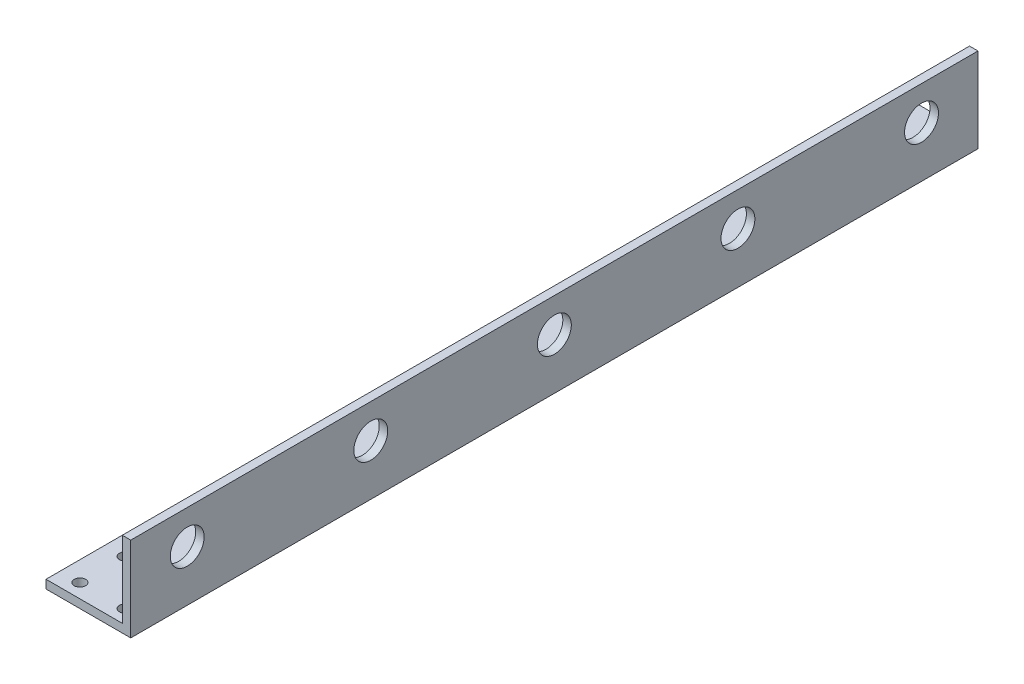
ISO-10303-21;
HEADER;
FILE_DESCRIPTION(('STEP AP214'),'2;1');
FILE_NAME('part.step','',(''),(''),'','','');
FILE_SCHEMA(('AUTOMOTIVE_DESIGN { 1 0 10303 214 1 1 1 1 }'));
ENDSEC;
DATA;
#1=APPLICATION_CONTEXT('core data for automotive mechanical design processes');
#2=APPLICATION_PROTOCOL_DEFINITION('international standard','automotive_design',2000,#1);
#3=PRODUCT_CONTEXT('',#1,'mechanical');
#4=PRODUCT('Part','Part','',(#3));
#5=PRODUCT_RELATED_PRODUCT_CATEGORY('part','',(#4));
#6=PRODUCT_DEFINITION_FORMATION('','',#4);
#7=PRODUCT_DEFINITION_CONTEXT('part definition',#1,'design');
#8=PRODUCT_DEFINITION('design','',#6,#7);
#9=PRODUCT_DEFINITION_SHAPE('','',#8);
#10=(LENGTH_UNIT() NAMED_UNIT(*) SI_UNIT(.MILLI.,.METRE.));
#11=(NAMED_UNIT(*) PLANE_ANGLE_UNIT() SI_UNIT($,.RADIAN.));
#12=(NAMED_UNIT(*) SI_UNIT($,.STERADIAN.) SOLID_ANGLE_UNIT());
#13=UNCERTAINTY_MEASURE_WITH_UNIT(LENGTH_MEASURE(1.E-05),#10,'distance_accuracy_value','');
#14=(GEOMETRIC_REPRESENTATION_CONTEXT(3) GLOBAL_UNCERTAINTY_ASSIGNED_CONTEXT((#13)) GLOBAL_UNIT_ASSIGNED_CONTEXT((#10,
#11,#12)) REPRESENTATION_CONTEXT('',''));
#15=CARTESIAN_POINT('',(0.,0.,0.));
#16=DIRECTION('',(0.,0.,1.));
#17=DIRECTION('',(1.,0.,0.));
#18=AXIS2_PLACEMENT_3D('',#15,#16,#17);
#19=CARTESIAN_POINT('',(15.,-15.,300.));
#20=DIRECTION('',(-1.,0.,0.));
#21=DIRECTION('',(0.,0.,1.));
#22=AXIS2_PLACEMENT_3D('',#19,#20,#21);
#23=PLANE('',#22);
#24=CARTESIAN_POINT('',(15.,2.99999999999999,20.));
#25=DIRECTION('',(-1.,0.,0.));
#26=DIRECTION('',(0.,0.,1.));
#27=AXIS2_PLACEMENT_3D('',#24,#25,#26);
#28=CIRCLE('',#27,6.);
#29=CARTESIAN_POINT('',(15.,2.99999999999999,26.));
#30=VERTEX_POINT('',#29);
#31=EDGE_CURVE('E133',#30,#30,#28,.T.);
#32=ORIENTED_EDGE('',*,*,#31,.T.);
#33=EDGE_LOOP('',(#32));
#34=FACE_BOUND('',#33,.T.);
#35=CARTESIAN_POINT('',(15.,2.99999999999999,85.));
#36=DIRECTION('',(-1.,0.,0.));
#37=DIRECTION('',(0.,0.,1.));
#38=AXIS2_PLACEMENT_3D('',#35,#36,#37);
#39=CIRCLE('',#38,6.);
#40=CARTESIAN_POINT('',(15.,2.99999999999999,91.));
#41=VERTEX_POINT('',#40);
#42=EDGE_CURVE('E187',#41,#41,#39,.T.);
#43=ORIENTED_EDGE('',*,*,#42,.T.);
#44=EDGE_LOOP('',(#43));
#45=FACE_BOUND('',#44,.T.);
#46=CARTESIAN_POINT('',(15.,2.99999999999999,150.));
#47=DIRECTION('',(-1.,0.,0.));
#48=DIRECTION('',(0.,0.,1.));
#49=AXIS2_PLACEMENT_3D('',#46,#47,#48);
#50=CIRCLE('',#49,5.99999999999999);
#51=CARTESIAN_POINT('',(15.,2.99999999999999,156.));
#52=VERTEX_POINT('',#51);
#53=EDGE_CURVE('E191',#52,#52,#50,.T.);
#54=ORIENTED_EDGE('',*,*,#53,.T.);
#55=EDGE_LOOP('',(#54));
#56=FACE_BOUND('',#55,.T.);
#57=CARTESIAN_POINT('',(15.,2.99999999999999,215.));
#58=DIRECTION('',(-1.,0.,0.));
#59=DIRECTION('',(0.,0.,1.));
#60=AXIS2_PLACEMENT_3D('',#57,#58,#59);
#61=CIRCLE('',#60,5.99999999999999);
#62=CARTESIAN_POINT('',(15.,2.99999999999999,221.));
#63=VERTEX_POINT('',#62);
#64=EDGE_CURVE('E195',#63,#63,#61,.T.);
#65=ORIENTED_EDGE('',*,*,#64,.T.);
#66=EDGE_LOOP('',(#65));
#67=FACE_BOUND('',#66,.T.);
#68=CARTESIAN_POINT('',(15.,2.99999999999999,280.));
#69=DIRECTION('',(-1.,0.,0.));
#70=DIRECTION('',(0.,0.,1.));
#71=AXIS2_PLACEMENT_3D('',#68,#69,#70);
#72=CIRCLE('',#71,5.99999999999999);
#73=CARTESIAN_POINT('',(15.,2.99999999999999,286.));
#74=VERTEX_POINT('',#73);
#75=EDGE_CURVE('E198',#74,#74,#72,.T.);
#76=ORIENTED_EDGE('',*,*,#75,.T.);
#77=EDGE_LOOP('',(#76));
#78=FACE_BOUND('',#77,.T.);
#79=DIRECTION('',(0.,1.,0.));
#80=VECTOR('',#79,1.);
#81=CARTESIAN_POINT('',(15.,-15.,0.));
#82=LINE('',#81,#80);
#83=CARTESIAN_POINT('',(15.,-15.,0.));
#84=VERTEX_POINT('',#83);
#85=CARTESIAN_POINT('',(15.,15.,0.));
#86=VERTEX_POINT('',#85);
#87=EDGE_CURVE('E128',#84,#86,#82,.T.);
#88=ORIENTED_EDGE('',*,*,#87,.T.);
#89=DIRECTION('',(0.,0.,-1.));
#90=VECTOR('',#89,1.);
#91=CARTESIAN_POINT('',(15.,15.,300.));
#92=LINE('',#91,#90);
#93=CARTESIAN_POINT('',(15.,15.,300.));
#94=VERTEX_POINT('',#93);
#95=EDGE_CURVE('E11',#94,#86,#92,.T.);
#96=ORIENTED_EDGE('',*,*,#95,.F.);
#97=DIRECTION('',(0.,1.,0.));
#98=VECTOR('',#97,1.);
#99=CARTESIAN_POINT('',(15.,-15.,300.));
#100=LINE('',#99,#98);
#101=CARTESIAN_POINT('',(15.,-15.,300.));
#102=VERTEX_POINT('',#101);
#103=EDGE_CURVE('E145',#102,#94,#100,.T.);
#104=ORIENTED_EDGE('',*,*,#103,.F.);
#105=DIRECTION('',(0.,0.,-1.));
#106=VECTOR('',#105,1.);
#107=CARTESIAN_POINT('',(15.,-15.,300.));
#108=LINE('',#107,#106);
#109=EDGE_CURVE('E124',#102,#84,#108,.T.);
#110=ORIENTED_EDGE('',*,*,#109,.T.);
#111=EDGE_LOOP('',(#88,#96,#104,#110));
#112=FACE_BOUND('',#111,.T.);
#113=ADVANCED_FACE('F39',(#34,#45,#56,#67,#78,#112),#23,.F.);
#114=CARTESIAN_POINT('',(12.,15.,300.));
#115=DIRECTION('',(0.,-1.,0.));
#116=DIRECTION('',(0.,0.,-1.));
#117=AXIS2_PLACEMENT_3D('',#114,#115,#116);
#118=PLANE('',#117);
#119=DIRECTION('',(-1.,0.,0.));
#120=VECTOR('',#119,1.);
#121=CARTESIAN_POINT('',(12.,15.,0.));
#122=LINE('',#121,#120);
#123=CARTESIAN_POINT('',(12.,15.,0.));
#124=VERTEX_POINT('',#123);
#125=EDGE_CURVE('E132',#86,#124,#122,.T.);
#126=ORIENTED_EDGE('',*,*,#125,.T.);
#127=DIRECTION('',(0.,0.,-1.));
#128=VECTOR('',#127,1.);
#129=CARTESIAN_POINT('',(12.,15.,300.));
#130=LINE('',#129,#128);
#131=CARTESIAN_POINT('',(12.,15.,300.));
#132=VERTEX_POINT('',#131);
#133=EDGE_CURVE('E48',#132,#124,#130,.T.);
#134=ORIENTED_EDGE('',*,*,#133,.F.);
#135=DIRECTION('',(-1.,0.,0.));
#136=VECTOR('',#135,1.);
#137=CARTESIAN_POINT('',(12.,15.,300.));
#138=LINE('',#137,#136);
#139=EDGE_CURVE('E93',#94,#132,#138,.T.);
#140=ORIENTED_EDGE('',*,*,#139,.F.);
#141=ORIENTED_EDGE('',*,*,#95,.T.);
#142=EDGE_LOOP('',(#126,#134,#140,#141));
#143=FACE_BOUND('',#142,.T.);
#144=ADVANCED_FACE('F176',(#143),#118,.F.);
#145=CARTESIAN_POINT('',(12.,15.,300.));
#146=DIRECTION('',(1.,0.,0.));
#147=DIRECTION('',(0.,0.,-1.));
#148=AXIS2_PLACEMENT_3D('',#145,#146,#147);
#149=PLANE('',#148);
#150=CARTESIAN_POINT('',(12.,2.99999999999999,20.));
#151=DIRECTION('',(-1.,0.,0.));
#152=DIRECTION('',(0.,0.,1.));
#153=AXIS2_PLACEMENT_3D('',#150,#151,#152);
#154=CIRCLE('',#153,6.);
#155=CARTESIAN_POINT('',(12.,2.99999999999999,26.));
#156=VERTEX_POINT('',#155);
#157=EDGE_CURVE('E201',#156,#156,#154,.T.);
#158=ORIENTED_EDGE('',*,*,#157,.F.);
#159=EDGE_LOOP('',(#158));
#160=FACE_BOUND('',#159,.T.);
#161=CARTESIAN_POINT('',(12.,2.99999999999999,85.));
#162=DIRECTION('',(-1.,0.,0.));
#163=DIRECTION('',(0.,0.,1.));
#164=AXIS2_PLACEMENT_3D('',#161,#162,#163);
#165=CIRCLE('',#164,6.);
#166=CARTESIAN_POINT('',(12.,2.99999999999999,91.));
#167=VERTEX_POINT('',#166);
#168=EDGE_CURVE('E207',#167,#167,#165,.T.);
#169=ORIENTED_EDGE('',*,*,#168,.F.);
#170=EDGE_LOOP('',(#169));
#171=FACE_BOUND('',#170,.T.);
#172=CARTESIAN_POINT('',(12.,2.99999999999999,150.));
#173=DIRECTION('',(-1.,0.,0.));
#174=DIRECTION('',(0.,0.,1.));
#175=AXIS2_PLACEMENT_3D('',#172,#173,#174);
#176=CIRCLE('',#175,5.99999999999999);
#177=CARTESIAN_POINT('',(12.,2.99999999999999,156.));
#178=VERTEX_POINT('',#177);
#179=EDGE_CURVE('E230',#178,#178,#176,.T.);
#180=ORIENTED_EDGE('',*,*,#179,.F.);
#181=EDGE_LOOP('',(#180));
#182=FACE_BOUND('',#181,.T.);
#183=CARTESIAN_POINT('',(12.,2.99999999999999,215.));
#184=DIRECTION('',(-1.,0.,0.));
#185=DIRECTION('',(0.,0.,1.));
#186=AXIS2_PLACEMENT_3D('',#183,#184,#185);
#187=CIRCLE('',#186,5.99999999999999);
#188=CARTESIAN_POINT('',(12.,2.99999999999999,221.));
#189=VERTEX_POINT('',#188);
#190=EDGE_CURVE('E225',#189,#189,#187,.T.);
#191=ORIENTED_EDGE('',*,*,#190,.F.);
#192=EDGE_LOOP('',(#191));
#193=FACE_BOUND('',#192,.T.);
#194=CARTESIAN_POINT('',(12.,2.99999999999999,280.));
#195=DIRECTION('',(-1.,0.,0.));
#196=DIRECTION('',(0.,0.,1.));
#197=AXIS2_PLACEMENT_3D('',#194,#195,#196);
#198=CIRCLE('',#197,5.99999999999999);
#199=CARTESIAN_POINT('',(12.,2.99999999999999,286.));
#200=VERTEX_POINT('',#199);
#201=EDGE_CURVE('E210',#200,#200,#198,.T.);
#202=ORIENTED_EDGE('',*,*,#201,.F.);
#203=EDGE_LOOP('',(#202));
#204=FACE_BOUND('',#203,.T.);
#205=DIRECTION('',(0.,-1.,0.));
#206=VECTOR('',#205,1.);
#207=CARTESIAN_POINT('',(12.,15.,0.));
#208=LINE('',#207,#206);
#209=CARTESIAN_POINT('',(12.,-12.,0.));
#210=VERTEX_POINT('',#209);
#211=EDGE_CURVE('E136',#124,#210,#208,.T.);
#212=ORIENTED_EDGE('',*,*,#211,.T.);
#213=DIRECTION('',(0.,0.,-1.));
#214=VECTOR('',#213,1.);
#215=CARTESIAN_POINT('',(12.,-12.,300.));
#216=LINE('',#215,#214);
#217=CARTESIAN_POINT('',(12.,-12.,300.));
#218=VERTEX_POINT('',#217);
#219=EDGE_CURVE('E117',#218,#210,#216,.T.);
#220=ORIENTED_EDGE('',*,*,#219,.F.);
#221=DIRECTION('',(0.,-1.,0.));
#222=VECTOR('',#221,1.);
#223=CARTESIAN_POINT('',(12.,15.,300.));
#224=LINE('',#223,#222);
#225=EDGE_CURVE('E106',#132,#218,#224,.T.);
#226=ORIENTED_EDGE('',*,*,#225,.F.);
#227=ORIENTED_EDGE('',*,*,#133,.T.);
#228=EDGE_LOOP('',(#212,#220,#226,#227));
#229=FACE_BOUND('',#228,.T.);
#230=ADVANCED_FACE('F155',(#160,#171,#182,#193,#204,#229),#149,.F.);
#231=CARTESIAN_POINT('',(-15.,-12.,300.));
#232=DIRECTION('',(0.,-1.,0.));
#233=DIRECTION('',(0.,0.,-1.));
#234=AXIS2_PLACEMENT_3D('',#231,#232,#233);
#235=PLANE('',#234);
#236=CARTESIAN_POINT('',(-7.99999999999994,-12.,21.0000000000001));
#237=DIRECTION('',(0.,-1.,0.));
#238=DIRECTION('',(0.,0.,-1.));
#239=AXIS2_PLACEMENT_3D('',#236,#237,#238);
#240=CIRCLE('',#239,2.);
#241=CARTESIAN_POINT('',(-7.99999999999994,-12.,19.0000000000001));
#242=VERTEX_POINT('',#241);
#243=EDGE_CURVE('E226',#242,#242,#240,.T.);
#244=ORIENTED_EDGE('',*,*,#243,.T.);
#245=EDGE_LOOP('',(#244));
#246=FACE_BOUND('',#245,.T.);
#247=CARTESIAN_POINT('',(8.,-12.,295.));
#248=DIRECTION('',(0.,-1.,0.));
#249=DIRECTION('',(0.,0.,-1.));
#250=AXIS2_PLACEMENT_3D('',#247,#248,#249);
#251=CIRCLE('',#250,2.);
#252=CARTESIAN_POINT('',(8.,-12.,293.));
#253=VERTEX_POINT('',#252);
#254=EDGE_CURVE('E240',#253,#253,#251,.T.);
#255=ORIENTED_EDGE('',*,*,#254,.T.);
#256=EDGE_LOOP('',(#255));
#257=FACE_BOUND('',#256,.T.);
#258=CARTESIAN_POINT('',(8.00000000000017,-12.,279.));
#259=DIRECTION('',(0.,-1.,0.));
#260=DIRECTION('',(0.,0.,-1.));
#261=AXIS2_PLACEMENT_3D('',#258,#259,#260);
#262=CIRCLE('',#261,2.);
#263=CARTESIAN_POINT('',(8.00000000000017,-12.,277.));
#264=VERTEX_POINT('',#263);
#265=EDGE_CURVE('E244',#264,#264,#262,.T.);
#266=ORIENTED_EDGE('',*,*,#265,.T.);
#267=EDGE_LOOP('',(#266));
#268=FACE_BOUND('',#267,.T.);
#269=CARTESIAN_POINT('',(-7.99999999999983,-12.,279.));
#270=DIRECTION('',(0.,-1.,0.));
#271=DIRECTION('',(0.,0.,-1.));
#272=AXIS2_PLACEMENT_3D('',#269,#270,#271);
#273=CIRCLE('',#272,2.00000000000001);
#274=CARTESIAN_POINT('',(-7.99999999999983,-12.,277.));
#275=VERTEX_POINT('',#274);
#276=EDGE_CURVE('E248',#275,#275,#273,.T.);
#277=ORIENTED_EDGE('',*,*,#276,.T.);
#278=EDGE_LOOP('',(#277));
#279=FACE_BOUND('',#278,.T.);
#280=CARTESIAN_POINT('',(-8.00000000000003,-12.,5.00000000000003));
#281=DIRECTION('',(0.,-1.,0.));
#282=DIRECTION('',(0.,0.,-1.));
#283=AXIS2_PLACEMENT_3D('',#280,#281,#282);
#284=CIRCLE('',#283,2.);
#285=CARTESIAN_POINT('',(-8.00000000000003,-12.,3.00000000000003));
#286=VERTEX_POINT('',#285);
#287=EDGE_CURVE('E252',#286,#286,#284,.T.);
#288=ORIENTED_EDGE('',*,*,#287,.T.);
#289=EDGE_LOOP('',(#288));
#290=FACE_BOUND('',#289,.T.);
#291=CARTESIAN_POINT('',(8.,-12.,5.));
#292=DIRECTION('',(0.,-1.,0.));
#293=DIRECTION('',(0.,0.,-1.));
#294=AXIS2_PLACEMENT_3D('',#291,#292,#293);
#295=CIRCLE('',#294,2.);
#296=CARTESIAN_POINT('',(8.,-12.,3.));
#297=VERTEX_POINT('',#296);
#298=EDGE_CURVE('E256',#297,#297,#295,.T.);
#299=ORIENTED_EDGE('',*,*,#298,.T.);
#300=EDGE_LOOP('',(#299));
#301=FACE_BOUND('',#300,.T.);
#302=CARTESIAN_POINT('',(8.00000000000009,-12.,20.9999999999999));
#303=DIRECTION('',(0.,-1.,0.));
#304=DIRECTION('',(0.,0.,-1.));
#305=AXIS2_PLACEMENT_3D('',#302,#303,#304);
#306=CIRCLE('',#305,2.);
#307=CARTESIAN_POINT('',(8.00000000000009,-12.,18.9999999999999));
#308=VERTEX_POINT('',#307);
#309=EDGE_CURVE('E260',#308,#308,#306,.T.);
#310=ORIENTED_EDGE('',*,*,#309,.T.);
#311=EDGE_LOOP('',(#310));
#312=FACE_BOUND('',#311,.T.);
#313=CARTESIAN_POINT('',(-7.99999999999984,-12.,295.));
#314=DIRECTION('',(0.,-1.,0.));
#315=DIRECTION('',(0.,0.,-1.));
#316=AXIS2_PLACEMENT_3D('',#313,#314,#315);
#317=CIRCLE('',#316,2.00000000000005);
#318=CARTESIAN_POINT('',(-7.99999999999984,-12.,293.));
#319=VERTEX_POINT('',#318);
#320=EDGE_CURVE('E264',#319,#319,#317,.T.);
#321=ORIENTED_EDGE('',*,*,#320,.T.);
#322=EDGE_LOOP('',(#321));
#323=FACE_BOUND('',#322,.T.);
#324=DIRECTION('',(-1.,0.,0.));
#325=VECTOR('',#324,1.);
#326=CARTESIAN_POINT('',(-15.,-12.,0.));
#327=LINE('',#326,#325);
#328=CARTESIAN_POINT('',(-15.,-12.,0.));
#329=VERTEX_POINT('',#328);
#330=EDGE_CURVE('E115',#210,#329,#327,.T.);
#331=ORIENTED_EDGE('',*,*,#330,.T.);
#332=DIRECTION('',(0.,0.,-1.));
#333=VECTOR('',#332,1.);
#334=CARTESIAN_POINT('',(-15.,-12.,300.));
#335=LINE('',#334,#333);
#336=CARTESIAN_POINT('',(-15.,-12.,300.));
#337=VERTEX_POINT('',#336);
#338=EDGE_CURVE('E112',#337,#329,#335,.T.);
#339=ORIENTED_EDGE('',*,*,#338,.F.);
#340=DIRECTION('',(-1.,0.,0.));
#341=VECTOR('',#340,1.);
#342=CARTESIAN_POINT('',(-15.,-12.,300.));
#343=LINE('',#342,#341);
#344=EDGE_CURVE('E100',#218,#337,#343,.T.);
#345=ORIENTED_EDGE('',*,*,#344,.F.);
#346=ORIENTED_EDGE('',*,*,#219,.T.);
#347=EDGE_LOOP('',(#331,#339,#345,#346));
#348=FACE_BOUND('',#347,.T.);
#349=ADVANCED_FACE('F113',(#246,#257,#268,#279,#290,#301,#312,#323,#348),#235,.F.);
#350=CARTESIAN_POINT('',(-15.,-15.,300.));
#351=DIRECTION('',(1.,0.,0.));
#352=DIRECTION('',(0.,0.,-1.));
#353=AXIS2_PLACEMENT_3D('',#350,#351,#352);
#354=PLANE('',#353);
#355=DIRECTION('',(0.,-1.,0.));
#356=VECTOR('',#355,1.);
#357=CARTESIAN_POINT('',(-15.,-15.,0.));
#358=LINE('',#357,#356);
#359=CARTESIAN_POINT('',(-15.,-15.,0.));
#360=VERTEX_POINT('',#359);
#361=EDGE_CURVE('E79',#329,#360,#358,.T.);
#362=ORIENTED_EDGE('',*,*,#361,.T.);
#363=DIRECTION('',(0.,0.,-1.));
#364=VECTOR('',#363,1.);
#365=CARTESIAN_POINT('',(-15.,-15.,300.));
#366=LINE('',#365,#364);
#367=CARTESIAN_POINT('',(-15.,-15.,300.));
#368=VERTEX_POINT('',#367);
#369=EDGE_CURVE('E118',#368,#360,#366,.T.);
#370=ORIENTED_EDGE('',*,*,#369,.F.);
#371=DIRECTION('',(0.,-1.,0.));
#372=VECTOR('',#371,1.);
#373=CARTESIAN_POINT('',(-15.,-15.,300.));
#374=LINE('',#373,#372);
#375=EDGE_CURVE('E104',#337,#368,#374,.T.);
#376=ORIENTED_EDGE('',*,*,#375,.F.);
#377=ORIENTED_EDGE('',*,*,#338,.T.);
#378=EDGE_LOOP('',(#362,#370,#376,#377));
#379=FACE_BOUND('',#378,.T.);
#380=ADVANCED_FACE('F120',(#379),#354,.F.);
#381=CARTESIAN_POINT('',(-15.,-15.,300.));
#382=DIRECTION('',(0.,1.,0.));
#383=DIRECTION('',(0.,0.,1.));
#384=AXIS2_PLACEMENT_3D('',#381,#382,#383);
#385=PLANE('',#384);
#386=CARTESIAN_POINT('',(-7.99999999999994,-15.,21.0000000000001));
#387=DIRECTION('',(0.,-1.,0.));
#388=DIRECTION('',(0.,0.,-1.));
#389=AXIS2_PLACEMENT_3D('',#386,#387,#388);
#390=CIRCLE('',#389,2.);
#391=CARTESIAN_POINT('',(-7.99999999999994,-15.,19.0000000000001));
#392=VERTEX_POINT('',#391);
#393=EDGE_CURVE('E281',#392,#392,#390,.T.);
#394=ORIENTED_EDGE('',*,*,#393,.F.);
#395=EDGE_LOOP('',(#394));
#396=FACE_BOUND('',#395,.T.);
#397=CARTESIAN_POINT('',(8.,-15.,295.));
#398=DIRECTION('',(0.,-1.,0.));
#399=DIRECTION('',(0.,0.,-1.));
#400=AXIS2_PLACEMENT_3D('',#397,#398,#399);
#401=CIRCLE('',#400,2.);
#402=CARTESIAN_POINT('',(8.,-15.,293.));
#403=VERTEX_POINT('',#402);
#404=EDGE_CURVE('E277',#403,#403,#401,.T.);
#405=ORIENTED_EDGE('',*,*,#404,.F.);
#406=EDGE_LOOP('',(#405));
#407=FACE_BOUND('',#406,.T.);
#408=CARTESIAN_POINT('',(8.00000000000017,-15.,279.));
#409=DIRECTION('',(0.,-1.,0.));
#410=DIRECTION('',(0.,0.,-1.));
#411=AXIS2_PLACEMENT_3D('',#408,#409,#410);
#412=CIRCLE('',#411,2.);
#413=CARTESIAN_POINT('',(8.00000000000017,-15.,277.));
#414=VERTEX_POINT('',#413);
#415=EDGE_CURVE('E273',#414,#414,#412,.T.);
#416=ORIENTED_EDGE('',*,*,#415,.F.);
#417=EDGE_LOOP('',(#416));
#418=FACE_BOUND('',#417,.T.);
#419=CARTESIAN_POINT('',(-7.99999999999983,-15.,279.));
#420=DIRECTION('',(0.,-1.,0.));
#421=DIRECTION('',(0.,0.,-1.));
#422=AXIS2_PLACEMENT_3D('',#419,#420,#421);
#423=CIRCLE('',#422,2.00000000000001);
#424=CARTESIAN_POINT('',(-7.99999999999983,-15.,277.));
#425=VERTEX_POINT('',#424);
#426=EDGE_CURVE('E272',#425,#425,#423,.T.);
#427=ORIENTED_EDGE('',*,*,#426,.F.);
#428=EDGE_LOOP('',(#427));
#429=FACE_BOUND('',#428,.T.);
#430=CARTESIAN_POINT('',(-8.00000000000003,-15.,5.00000000000003));
#431=DIRECTION('',(0.,-1.,0.));
#432=DIRECTION('',(0.,0.,-1.));
#433=AXIS2_PLACEMENT_3D('',#430,#431,#432);
#434=CIRCLE('',#433,2.);
#435=CARTESIAN_POINT('',(-8.00000000000003,-15.,3.00000000000003));
#436=VERTEX_POINT('',#435);
#437=EDGE_CURVE('E285',#436,#436,#434,.T.);
#438=ORIENTED_EDGE('',*,*,#437,.F.);
#439=EDGE_LOOP('',(#438));
#440=FACE_BOUND('',#439,.T.);
#441=CARTESIAN_POINT('',(8.,-15.,5.));
#442=DIRECTION('',(0.,-1.,0.));
#443=DIRECTION('',(0.,0.,-1.));
#444=AXIS2_PLACEMENT_3D('',#441,#442,#443);
#445=CIRCLE('',#444,2.);
#446=CARTESIAN_POINT('',(8.,-15.,3.));
#447=VERTEX_POINT('',#446);
#448=EDGE_CURVE('E293',#447,#447,#445,.T.);
#449=ORIENTED_EDGE('',*,*,#448,.F.);
#450=EDGE_LOOP('',(#449));
#451=FACE_BOUND('',#450,.T.);
#452=CARTESIAN_POINT('',(8.00000000000009,-15.,20.9999999999999));
#453=DIRECTION('',(0.,-1.,0.));
#454=DIRECTION('',(0.,0.,-1.));
#455=AXIS2_PLACEMENT_3D('',#452,#453,#454);
#456=CIRCLE('',#455,2.);
#457=CARTESIAN_POINT('',(8.00000000000009,-15.,18.9999999999999));
#458=VERTEX_POINT('',#457);
#459=EDGE_CURVE('E289',#458,#458,#456,.T.);
#460=ORIENTED_EDGE('',*,*,#459,.F.);
#461=EDGE_LOOP('',(#460));
#462=FACE_BOUND('',#461,.T.);
#463=CARTESIAN_POINT('',(-7.99999999999984,-15.,295.));
#464=DIRECTION('',(0.,-1.,0.));
#465=DIRECTION('',(0.,0.,-1.));
#466=AXIS2_PLACEMENT_3D('',#463,#464,#465);
#467=CIRCLE('',#466,2.00000000000005);
#468=CARTESIAN_POINT('',(-7.99999999999984,-15.,293.));
#469=VERTEX_POINT('',#468);
#470=EDGE_CURVE('E268',#469,#469,#467,.T.);
#471=ORIENTED_EDGE('',*,*,#470,.F.);
#472=EDGE_LOOP('',(#471));
#473=FACE_BOUND('',#472,.T.);
#474=DIRECTION('',(1.,0.,0.));
#475=VECTOR('',#474,1.);
#476=CARTESIAN_POINT('',(-15.,-15.,0.));
#477=LINE('',#476,#475);
#478=EDGE_CURVE('E85',#360,#84,#477,.T.);
#479=ORIENTED_EDGE('',*,*,#478,.T.);
#480=ORIENTED_EDGE('',*,*,#109,.F.);
#481=DIRECTION('',(1.,0.,0.));
#482=VECTOR('',#481,1.);
#483=CARTESIAN_POINT('',(-15.,-15.,300.));
#484=LINE('',#483,#482);
#485=EDGE_CURVE('E56',#368,#102,#484,.T.);
#486=ORIENTED_EDGE('',*,*,#485,.F.);
#487=ORIENTED_EDGE('',*,*,#369,.T.);
#488=EDGE_LOOP('',(#479,#480,#486,#487));
#489=FACE_BOUND('',#488,.T.);
#490=ADVANCED_FACE('F162',(#396,#407,#418,#429,#440,#451,#462,#473,#489),#385,.F.);
#491=CARTESIAN_POINT('',(0.,0.,300.));
#492=DIRECTION('',(0.,0.,-1.));
#493=DIRECTION('',(-1.,0.,0.));
#494=AXIS2_PLACEMENT_3D('',#491,#492,#493);
#495=PLANE('',#494);
#496=ORIENTED_EDGE('',*,*,#103,.T.);
#497=ORIENTED_EDGE('',*,*,#139,.T.);
#498=ORIENTED_EDGE('',*,*,#225,.T.);
#499=ORIENTED_EDGE('',*,*,#344,.T.);
#500=ORIENTED_EDGE('',*,*,#375,.T.);
#501=ORIENTED_EDGE('',*,*,#485,.T.);
#502=EDGE_LOOP('',(#496,#497,#498,#499,#500,#501));
#503=FACE_BOUND('',#502,.T.);
#504=ADVANCED_FACE('F102',(#503),#495,.F.);
#505=CARTESIAN_POINT('',(0.,0.,0.));
#506=DIRECTION('',(0.,0.,-1.));
#507=DIRECTION('',(-1.,0.,0.));
#508=AXIS2_PLACEMENT_3D('',#505,#506,#507);
#509=PLANE('',#508);
#510=ORIENTED_EDGE('',*,*,#87,.F.);
#511=ORIENTED_EDGE('',*,*,#478,.F.);
#512=ORIENTED_EDGE('',*,*,#361,.F.);
#513=ORIENTED_EDGE('',*,*,#330,.F.);
#514=ORIENTED_EDGE('',*,*,#211,.F.);
#515=ORIENTED_EDGE('',*,*,#125,.F.);
#516=EDGE_LOOP('',(#510,#511,#512,#513,#514,#515));
#517=FACE_BOUND('',#516,.T.);
#518=ADVANCED_FACE('F158',(#517),#509,.T.);
#519=CARTESIAN_POINT('',(312.,2.99999999999999,280.));
#520=DIRECTION('',(-1.,0.,0.));
#521=DIRECTION('',(0.,0.,1.));
#522=AXIS2_PLACEMENT_3D('',#519,#520,#521);
#523=CYLINDRICAL_SURFACE('',#522,5.99999999999999);
#524=ORIENTED_EDGE('',*,*,#201,.T.);
#525=EDGE_LOOP('',(#524));
#526=FACE_BOUND('',#525,.T.);
#527=ORIENTED_EDGE('',*,*,#75,.F.);
#528=EDGE_LOOP('',(#527));
#529=FACE_BOUND('',#528,.T.);
#530=ADVANCED_FACE('F382',(#526,#529),#523,.F.);
#531=CARTESIAN_POINT('',(312.,2.99999999999999,215.));
#532=DIRECTION('',(-1.,0.,0.));
#533=DIRECTION('',(0.,0.,1.));
#534=AXIS2_PLACEMENT_3D('',#531,#532,#533);
#535=CYLINDRICAL_SURFACE('',#534,5.99999999999999);
#536=ORIENTED_EDGE('',*,*,#190,.T.);
#537=EDGE_LOOP('',(#536));
#538=FACE_BOUND('',#537,.T.);
#539=ORIENTED_EDGE('',*,*,#64,.F.);
#540=EDGE_LOOP('',(#539));
#541=FACE_BOUND('',#540,.T.);
#542=ADVANCED_FACE('F378',(#538,#541),#535,.F.);
#543=CARTESIAN_POINT('',(312.,2.99999999999999,150.));
#544=DIRECTION('',(-1.,0.,0.));
#545=DIRECTION('',(0.,0.,1.));
#546=AXIS2_PLACEMENT_3D('',#543,#544,#545);
#547=CYLINDRICAL_SURFACE('',#546,5.99999999999999);
#548=ORIENTED_EDGE('',*,*,#179,.T.);
#549=EDGE_LOOP('',(#548));
#550=FACE_BOUND('',#549,.T.);
#551=ORIENTED_EDGE('',*,*,#53,.F.);
#552=EDGE_LOOP('',(#551));
#553=FACE_BOUND('',#552,.T.);
#554=ADVANCED_FACE('F374',(#550,#553),#547,.F.);
#555=CARTESIAN_POINT('',(312.,2.99999999999999,85.));
#556=DIRECTION('',(-1.,0.,0.));
#557=DIRECTION('',(0.,0.,1.));
#558=AXIS2_PLACEMENT_3D('',#555,#556,#557);
#559=CYLINDRICAL_SURFACE('',#558,6.);
#560=ORIENTED_EDGE('',*,*,#168,.T.);
#561=EDGE_LOOP('',(#560));
#562=FACE_BOUND('',#561,.T.);
#563=ORIENTED_EDGE('',*,*,#42,.F.);
#564=EDGE_LOOP('',(#563));
#565=FACE_BOUND('',#564,.T.);
#566=ADVANCED_FACE('F370',(#562,#565),#559,.F.);
#567=CARTESIAN_POINT('',(312.,2.99999999999999,20.));
#568=DIRECTION('',(-1.,0.,0.));
#569=DIRECTION('',(0.,0.,1.));
#570=AXIS2_PLACEMENT_3D('',#567,#568,#569);
#571=CYLINDRICAL_SURFACE('',#570,6.);
#572=ORIENTED_EDGE('',*,*,#157,.T.);
#573=EDGE_LOOP('',(#572));
#574=FACE_BOUND('',#573,.T.);
#575=ORIENTED_EDGE('',*,*,#31,.F.);
#576=EDGE_LOOP('',(#575));
#577=FACE_BOUND('',#576,.T.);
#578=ADVANCED_FACE('F315',(#574,#577),#571,.F.);
#579=CARTESIAN_POINT('',(-7.99999999999984,285.,295.));
#580=DIRECTION('',(0.,-1.,0.));
#581=DIRECTION('',(0.,0.,-1.));
#582=AXIS2_PLACEMENT_3D('',#579,#580,#581);
#583=CYLINDRICAL_SURFACE('',#582,2.00000000000005);
#584=ORIENTED_EDGE('',*,*,#470,.T.);
#585=EDGE_LOOP('',(#584));
#586=FACE_BOUND('',#585,.T.);
#587=ORIENTED_EDGE('',*,*,#320,.F.);
#588=EDGE_LOOP('',(#587));
#589=FACE_BOUND('',#588,.T.);
#590=ADVANCED_FACE('F311',(#586,#589),#583,.F.);
#591=CARTESIAN_POINT('',(8.00000000000009,285.,20.9999999999999));
#592=DIRECTION('',(0.,-1.,0.));
#593=DIRECTION('',(0.,0.,-1.));
#594=AXIS2_PLACEMENT_3D('',#591,#592,#593);
#595=CYLINDRICAL_SURFACE('',#594,2.);
#596=ORIENTED_EDGE('',*,*,#459,.T.);
#597=EDGE_LOOP('',(#596));
#598=FACE_BOUND('',#597,.T.);
#599=ORIENTED_EDGE('',*,*,#309,.F.);
#600=EDGE_LOOP('',(#599));
#601=FACE_BOUND('',#600,.T.);
#602=ADVANCED_FACE('F314',(#598,#601),#595,.F.);
#603=CARTESIAN_POINT('',(8.,285.,5.));
#604=DIRECTION('',(0.,-1.,0.));
#605=DIRECTION('',(0.,0.,-1.));
#606=AXIS2_PLACEMENT_3D('',#603,#604,#605);
#607=CYLINDRICAL_SURFACE('',#606,2.);
#608=ORIENTED_EDGE('',*,*,#448,.T.);
#609=EDGE_LOOP('',(#608));
#610=FACE_BOUND('',#609,.T.);
#611=ORIENTED_EDGE('',*,*,#298,.F.);
#612=EDGE_LOOP('',(#611));
#613=FACE_BOUND('',#612,.T.);
#614=ADVANCED_FACE('F342',(#610,#613),#607,.F.);
#615=CARTESIAN_POINT('',(-8.00000000000003,285.,5.00000000000003));
#616=DIRECTION('',(0.,-1.,0.));
#617=DIRECTION('',(0.,0.,-1.));
#618=AXIS2_PLACEMENT_3D('',#615,#616,#617);
#619=CYLINDRICAL_SURFACE('',#618,2.);
#620=ORIENTED_EDGE('',*,*,#437,.T.);
#621=EDGE_LOOP('',(#620));
#622=FACE_BOUND('',#621,.T.);
#623=ORIENTED_EDGE('',*,*,#287,.F.);
#624=EDGE_LOOP('',(#623));
#625=FACE_BOUND('',#624,.T.);
#626=ADVANCED_FACE('F301',(#622,#625),#619,.F.);
#627=CARTESIAN_POINT('',(-7.99999999999983,285.,279.));
#628=DIRECTION('',(0.,-1.,0.));
#629=DIRECTION('',(0.,0.,-1.));
#630=AXIS2_PLACEMENT_3D('',#627,#628,#629);
#631=CYLINDRICAL_SURFACE('',#630,2.00000000000001);
#632=ORIENTED_EDGE('',*,*,#426,.T.);
#633=EDGE_LOOP('',(#632));
#634=FACE_BOUND('',#633,.T.);
#635=ORIENTED_EDGE('',*,*,#276,.F.);
#636=EDGE_LOOP('',(#635));
#637=FACE_BOUND('',#636,.T.);
#638=ADVANCED_FACE('F361',(#634,#637),#631,.F.);
#639=CARTESIAN_POINT('',(8.00000000000017,285.,279.));
#640=DIRECTION('',(0.,-1.,0.));
#641=DIRECTION('',(0.,0.,-1.));
#642=AXIS2_PLACEMENT_3D('',#639,#640,#641);
#643=CYLINDRICAL_SURFACE('',#642,2.);
#644=ORIENTED_EDGE('',*,*,#415,.T.);
#645=EDGE_LOOP('',(#644));
#646=FACE_BOUND('',#645,.T.);
#647=ORIENTED_EDGE('',*,*,#265,.F.);
#648=EDGE_LOOP('',(#647));
#649=FACE_BOUND('',#648,.T.);
#650=ADVANCED_FACE('F356',(#646,#649),#643,.F.);
#651=CARTESIAN_POINT('',(8.,285.,295.));
#652=DIRECTION('',(0.,-1.,0.));
#653=DIRECTION('',(0.,0.,-1.));
#654=AXIS2_PLACEMENT_3D('',#651,#652,#653);
#655=CYLINDRICAL_SURFACE('',#654,2.);
#656=ORIENTED_EDGE('',*,*,#404,.T.);
#657=EDGE_LOOP('',(#656));
#658=FACE_BOUND('',#657,.T.);
#659=ORIENTED_EDGE('',*,*,#254,.F.);
#660=EDGE_LOOP('',(#659));
#661=FACE_BOUND('',#660,.T.);
#662=ADVANCED_FACE('F352',(#658,#661),#655,.F.);
#663=CARTESIAN_POINT('',(-7.99999999999994,285.,21.0000000000001));
#664=DIRECTION('',(0.,-1.,0.));
#665=DIRECTION('',(0.,0.,-1.));
#666=AXIS2_PLACEMENT_3D('',#663,#664,#665);
#667=CYLINDRICAL_SURFACE('',#666,2.);
#668=ORIENTED_EDGE('',*,*,#393,.T.);
#669=EDGE_LOOP('',(#668));
#670=FACE_BOUND('',#669,.T.);
#671=ORIENTED_EDGE('',*,*,#243,.F.);
#672=EDGE_LOOP('',(#671));
#673=FACE_BOUND('',#672,.T.);
#674=ADVANCED_FACE('F355',(#670,#673),#667,.F.);
#675=CLOSED_SHELL('',(#113,#144,#230,#349,#380,#490,#504,#518,#530,#542,#554,#566,#578,#590,
#602,#614,#626,#638,#650,#662,#674));
#676=MANIFOLD_SOLID_BREP('B2',#675);
#677=ADVANCED_BREP_SHAPE_REPRESENTATION('',(#18,#676),#14);
#678=SHAPE_DEFINITION_REPRESENTATION(#9,#677);
ENDSEC;
END-ISO-10303-21;
